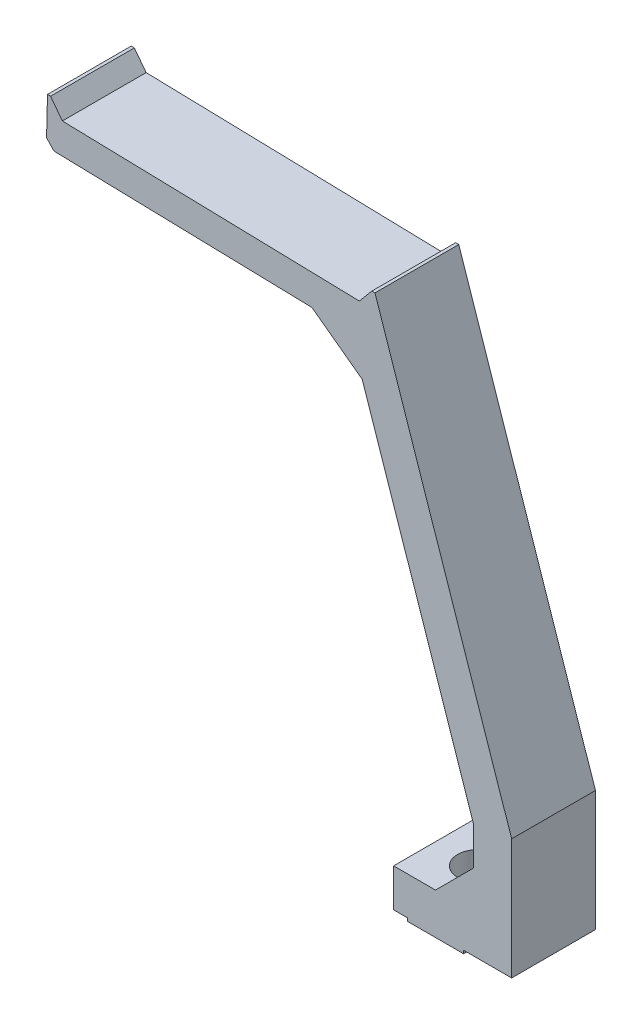
ISO-10303-21;
HEADER;
FILE_DESCRIPTION(('STEP AP214'),'2;1');
FILE_NAME('part.step','',(''),(''),'','','');
FILE_SCHEMA(('AUTOMOTIVE_DESIGN { 1 0 10303 214 1 1 1 1 }'));
ENDSEC;
DATA;
#1=APPLICATION_CONTEXT('core data for automotive mechanical design processes');
#2=APPLICATION_PROTOCOL_DEFINITION('international standard','automotive_design',2000,#1);
#3=PRODUCT_CONTEXT('',#1,'mechanical');
#4=PRODUCT('Part','Part','',(#3));
#5=PRODUCT_RELATED_PRODUCT_CATEGORY('part','',(#4));
#6=PRODUCT_DEFINITION_FORMATION('','',#4);
#7=PRODUCT_DEFINITION_CONTEXT('part definition',#1,'design');
#8=PRODUCT_DEFINITION('design','',#6,#7);
#9=PRODUCT_DEFINITION_SHAPE('','',#8);
#10=(LENGTH_UNIT() NAMED_UNIT(*) SI_UNIT(.MILLI.,.METRE.));
#11=(NAMED_UNIT(*) PLANE_ANGLE_UNIT() SI_UNIT($,.RADIAN.));
#12=(NAMED_UNIT(*) SI_UNIT($,.STERADIAN.) SOLID_ANGLE_UNIT());
#13=UNCERTAINTY_MEASURE_WITH_UNIT(LENGTH_MEASURE(1.E-05),#10,'distance_accuracy_value','');
#14=(GEOMETRIC_REPRESENTATION_CONTEXT(3) GLOBAL_UNCERTAINTY_ASSIGNED_CONTEXT((#13)) GLOBAL_UNIT_ASSIGNED_CONTEXT((#10,
#11,#12)) REPRESENTATION_CONTEXT('',''));
#15=CARTESIAN_POINT('',(0.,0.,0.));
#16=DIRECTION('',(0.,0.,1.));
#17=DIRECTION('',(1.,0.,0.));
#18=AXIS2_PLACEMENT_3D('',#15,#16,#17);
#19=CARTESIAN_POINT('',(0.,5.4,11.));
#20=DIRECTION('',(-0.707106781186547,0.707106781186548,0.));
#21=DIRECTION('',(0.,0.,1.));
#22=AXIS2_PLACEMENT_3D('',#19,#20,#21);
#23=PLANE('',#22);
#24=CARTESIAN_POINT('',(0.,5.40000000000002,5.5));
#25=DIRECTION('',(-0.707106781186547,0.707106781186548,0.));
#26=DIRECTION('',(-0.707106781186548,-0.707106781186547,0.));
#27=AXIS2_PLACEMENT_3D('',#24,#25,#26);
#28=ELLIPSE('',#27,7.07106781186548,5.);
#29=CARTESIAN_POINT('',(0.,5.4,10.5));
#30=VERTEX_POINT('',#29);
#31=CARTESIAN_POINT('',(4.99999999999998,10.4,5.5));
#32=VERTEX_POINT('',#31);
#33=EDGE_CURVE('E11',#30,#32,#28,.T.);
#34=ORIENTED_EDGE('',*,*,#33,.F.);
#35=DIRECTION('',(0.,0.,-1.));
#36=VECTOR('',#35,1.);
#37=CARTESIAN_POINT('',(0.,5.4,0.));
#38=LINE('',#37,#36);
#39=CARTESIAN_POINT('',(0.,5.4,11.));
#40=VERTEX_POINT('',#39);
#41=EDGE_CURVE('E201',#40,#30,#38,.T.);
#42=ORIENTED_EDGE('',*,*,#41,.F.);
#43=DIRECTION('',(0.707106781186548,0.707106781186547,0.));
#44=VECTOR('',#43,1.);
#45=CARTESIAN_POINT('',(-2.70000000000001,2.70000000000001,11.));
#46=LINE('',#45,#44);
#47=CARTESIAN_POINT('',(5.,10.4,11.));
#48=VERTEX_POINT('',#47);
#49=EDGE_CURVE('E225',#48,#40,#46,.F.);
#50=ORIENTED_EDGE('',*,*,#49,.F.);
#51=DIRECTION('',(0.,0.,1.));
#52=VECTOR('',#51,1.);
#53=CARTESIAN_POINT('',(5.,10.4,11.));
#54=LINE('',#53,#52);
#55=EDGE_CURVE('E202',#32,#48,#54,.T.);
#56=ORIENTED_EDGE('',*,*,#55,.F.);
#57=EDGE_LOOP('',(#34,#42,#50,#56));
#58=FACE_BOUND('',#57,.T.);
#59=ADVANCED_FACE('F36',(#58),#23,.T.);
#60=CARTESIAN_POINT('',(0.,5.4,0.499999999999997));
#61=VERTEX_POINT('',#60);
#62=EDGE_CURVE('E40',#32,#61,#28,.T.);
#63=ORIENTED_EDGE('',*,*,#62,.F.);
#64=CARTESIAN_POINT('',(5.,10.4,0.));
#65=VERTEX_POINT('',#64);
#66=EDGE_CURVE('E211',#65,#32,#54,.T.);
#67=ORIENTED_EDGE('',*,*,#66,.F.);
#68=DIRECTION('',(-0.707106781186548,-0.707106781186547,0.));
#69=VECTOR('',#68,1.);
#70=CARTESIAN_POINT('',(0.,5.4,0.));
#71=LINE('',#70,#69);
#72=CARTESIAN_POINT('',(0.,5.4,0.));
#73=VERTEX_POINT('',#72);
#74=EDGE_CURVE('E223',#73,#65,#71,.F.);
#75=ORIENTED_EDGE('',*,*,#74,.F.);
#76=EDGE_CURVE('E209',#61,#73,#38,.T.);
#77=ORIENTED_EDGE('',*,*,#76,.F.);
#78=EDGE_LOOP('',(#63,#67,#75,#77));
#79=FACE_BOUND('',#78,.T.);
#80=ADVANCED_FACE('F263',(#79),#23,.T.);
#81=CARTESIAN_POINT('',(-5.5,0.4,11.));
#82=DIRECTION('',(1.,0.,0.));
#83=DIRECTION('',(0.,1.,0.));
#84=AXIS2_PLACEMENT_3D('',#81,#82,#83);
#85=PLANE('',#84);
#86=DIRECTION('',(0.,-1.,0.));
#87=VECTOR('',#86,1.);
#88=CARTESIAN_POINT('',(-5.5,0.4,0.));
#89=LINE('',#88,#87);
#90=CARTESIAN_POINT('',(-5.5,5.4,0.));
#91=VERTEX_POINT('',#90);
#92=CARTESIAN_POINT('',(-5.5,0.4,0.));
#93=VERTEX_POINT('',#92);
#94=EDGE_CURVE('E564',#91,#93,#89,.T.);
#95=ORIENTED_EDGE('',*,*,#94,.T.);
#96=DIRECTION('',(0.,0.,-1.));
#97=VECTOR('',#96,1.);
#98=CARTESIAN_POINT('',(-5.5,0.4,11.));
#99=LINE('',#98,#97);
#100=CARTESIAN_POINT('',(-5.5,0.4,11.));
#101=VERTEX_POINT('',#100);
#102=EDGE_CURVE('E213',#101,#93,#99,.T.);
#103=ORIENTED_EDGE('',*,*,#102,.F.);
#104=DIRECTION('',(0.,-1.,0.));
#105=VECTOR('',#104,1.);
#106=CARTESIAN_POINT('',(-5.5,0.4,11.));
#107=LINE('',#106,#105);
#108=CARTESIAN_POINT('',(-5.5,5.4,11.));
#109=VERTEX_POINT('',#108);
#110=EDGE_CURVE('E512',#109,#101,#107,.T.);
#111=ORIENTED_EDGE('',*,*,#110,.F.);
#112=DIRECTION('',(0.,0.,-1.));
#113=VECTOR('',#112,1.);
#114=CARTESIAN_POINT('',(-5.5,5.4,11.));
#115=LINE('',#114,#113);
#116=EDGE_CURVE('E513',#109,#91,#115,.T.);
#117=ORIENTED_EDGE('',*,*,#116,.T.);
#118=EDGE_LOOP('',(#95,#103,#111,#117));
#119=FACE_BOUND('',#118,.T.);
#120=ADVANCED_FACE('F268',(#119),#85,.F.);
#121=CARTESIAN_POINT('',(-5.5,0.4,11.));
#122=DIRECTION('',(0.,1.,0.));
#123=DIRECTION('',(-1.,0.,0.));
#124=AXIS2_PLACEMENT_3D('',#121,#122,#123);
#125=PLANE('',#124);
#126=DIRECTION('',(1.,0.,0.));
#127=VECTOR('',#126,1.);
#128=CARTESIAN_POINT('',(-5.5,0.4,0.));
#129=LINE('',#128,#127);
#130=CARTESIAN_POINT('',(-3.7,0.4,0.));
#131=VERTEX_POINT('',#130);
#132=EDGE_CURVE('E559',#93,#131,#129,.T.);
#133=ORIENTED_EDGE('',*,*,#132,.T.);
#134=DIRECTION('',(0.,0.,-1.));
#135=VECTOR('',#134,1.);
#136=CARTESIAN_POINT('',(-3.7,0.4,11.));
#137=LINE('',#136,#135);
#138=CARTESIAN_POINT('',(-3.7,0.4,11.));
#139=VERTEX_POINT('',#138);
#140=EDGE_CURVE('E551',#139,#131,#137,.T.);
#141=ORIENTED_EDGE('',*,*,#140,.F.);
#142=DIRECTION('',(1.,0.,0.));
#143=VECTOR('',#142,1.);
#144=CARTESIAN_POINT('',(-5.5,0.4,11.));
#145=LINE('',#144,#143);
#146=EDGE_CURVE('E560',#101,#139,#145,.T.);
#147=ORIENTED_EDGE('',*,*,#146,.F.);
#148=ORIENTED_EDGE('',*,*,#102,.T.);
#149=EDGE_LOOP('',(#133,#141,#147,#148));
#150=FACE_BOUND('',#149,.T.);
#151=ADVANCED_FACE('F273',(#150),#125,.F.);
#152=CARTESIAN_POINT('',(-3.7,0.4,11.));
#153=DIRECTION('',(1.,0.,0.));
#154=DIRECTION('',(0.,0.,-1.));
#155=AXIS2_PLACEMENT_3D('',#152,#153,#154);
#156=PLANE('',#155);
#157=DIRECTION('',(0.,-1.,0.));
#158=VECTOR('',#157,1.);
#159=CARTESIAN_POINT('',(-3.7,0.4,0.));
#160=LINE('',#159,#158);
#161=CARTESIAN_POINT('',(-3.7,0.,0.));
#162=VERTEX_POINT('',#161);
#163=EDGE_CURVE('E568',#131,#162,#160,.T.);
#164=ORIENTED_EDGE('',*,*,#163,.T.);
#165=DIRECTION('',(0.,0.,-1.));
#166=VECTOR('',#165,1.);
#167=CARTESIAN_POINT('',(-3.7,0.,11.));
#168=LINE('',#167,#166);
#169=CARTESIAN_POINT('',(-3.7,0.,11.));
#170=VERTEX_POINT('',#169);
#171=EDGE_CURVE('E549',#170,#162,#168,.T.);
#172=ORIENTED_EDGE('',*,*,#171,.F.);
#173=DIRECTION('',(0.,-1.,0.));
#174=VECTOR('',#173,1.);
#175=CARTESIAN_POINT('',(-3.7,0.4,11.));
#176=LINE('',#175,#174);
#177=EDGE_CURVE('E608',#139,#170,#176,.T.);
#178=ORIENTED_EDGE('',*,*,#177,.F.);
#179=ORIENTED_EDGE('',*,*,#140,.T.);
#180=EDGE_LOOP('',(#164,#172,#178,#179));
#181=FACE_BOUND('',#180,.T.);
#182=ADVANCED_FACE('F277',(#181),#156,.F.);
#183=CARTESIAN_POINT('',(-3.7,0.,11.));
#184=DIRECTION('',(0.,1.,0.));
#185=DIRECTION('',(0.,0.,1.));
#186=AXIS2_PLACEMENT_3D('',#183,#184,#185);
#187=PLANE('',#186);
#188=CARTESIAN_POINT('',(0.,0.,5.5));
#189=DIRECTION('',(0.,1.,0.));
#190=DIRECTION('',(0.,0.,1.));
#191=AXIS2_PLACEMENT_3D('',#188,#189,#190);
#192=CIRCLE('',#191,2.6);
#193=CARTESIAN_POINT('',(0.,0.,8.1));
#194=VERTEX_POINT('',#193);
#195=EDGE_CURVE('E566',#194,#194,#192,.T.);
#196=ORIENTED_EDGE('',*,*,#195,.T.);
#197=EDGE_LOOP('',(#196));
#198=FACE_BOUND('',#197,.T.);
#199=DIRECTION('',(1.,0.,0.));
#200=VECTOR('',#199,1.);
#201=CARTESIAN_POINT('',(-3.7,0.,0.));
#202=LINE('',#201,#200);
#203=CARTESIAN_POINT('',(3.7,0.,0.));
#204=VERTEX_POINT('',#203);
#205=EDGE_CURVE('E576',#162,#204,#202,.T.);
#206=ORIENTED_EDGE('',*,*,#205,.T.);
#207=DIRECTION('',(0.,0.,-1.));
#208=VECTOR('',#207,1.);
#209=CARTESIAN_POINT('',(3.7,0.,11.));
#210=LINE('',#209,#208);
#211=CARTESIAN_POINT('',(3.7,0.,11.));
#212=VERTEX_POINT('',#211);
#213=EDGE_CURVE('E546',#212,#204,#210,.T.);
#214=ORIENTED_EDGE('',*,*,#213,.F.);
#215=DIRECTION('',(1.,0.,0.));
#216=VECTOR('',#215,1.);
#217=CARTESIAN_POINT('',(-3.7,0.,11.));
#218=LINE('',#217,#216);
#219=EDGE_CURVE('E613',#170,#212,#218,.T.);
#220=ORIENTED_EDGE('',*,*,#219,.F.);
#221=ORIENTED_EDGE('',*,*,#171,.T.);
#222=EDGE_LOOP('',(#206,#214,#220,#221));
#223=FACE_BOUND('',#222,.T.);
#224=ADVANCED_FACE('F281',(#198,#223),#187,.F.);
#225=CARTESIAN_POINT('',(3.7,0.,11.));
#226=DIRECTION('',(-1.,0.,0.));
#227=DIRECTION('',(0.,0.,1.));
#228=AXIS2_PLACEMENT_3D('',#225,#226,#227);
#229=PLANE('',#228);
#230=DIRECTION('',(0.,1.,0.));
#231=VECTOR('',#230,1.);
#232=CARTESIAN_POINT('',(3.7,0.,0.));
#233=LINE('',#232,#231);
#234=CARTESIAN_POINT('',(3.7,0.4,0.));
#235=VERTEX_POINT('',#234);
#236=EDGE_CURVE('E578',#204,#235,#233,.T.);
#237=ORIENTED_EDGE('',*,*,#236,.T.);
#238=DIRECTION('',(0.,0.,-1.));
#239=VECTOR('',#238,1.);
#240=CARTESIAN_POINT('',(3.7,0.4,11.));
#241=LINE('',#240,#239);
#242=CARTESIAN_POINT('',(3.7,0.4,11.));
#243=VERTEX_POINT('',#242);
#244=EDGE_CURVE('E543',#243,#235,#241,.T.);
#245=ORIENTED_EDGE('',*,*,#244,.F.);
#246=DIRECTION('',(0.,1.,0.));
#247=VECTOR('',#246,1.);
#248=CARTESIAN_POINT('',(3.7,0.,11.));
#249=LINE('',#248,#247);
#250=EDGE_CURVE('E615',#212,#243,#249,.T.);
#251=ORIENTED_EDGE('',*,*,#250,.F.);
#252=ORIENTED_EDGE('',*,*,#213,.T.);
#253=EDGE_LOOP('',(#237,#245,#251,#252));
#254=FACE_BOUND('',#253,.T.);
#255=ADVANCED_FACE('F285',(#254),#229,.F.);
#256=CARTESIAN_POINT('',(3.7,0.4,11.));
#257=DIRECTION('',(0.,1.,0.));
#258=DIRECTION('',(-1.,0.,0.));
#259=AXIS2_PLACEMENT_3D('',#256,#257,#258);
#260=PLANE('',#259);
#261=DIRECTION('',(1.,0.,0.));
#262=VECTOR('',#261,1.);
#263=CARTESIAN_POINT('',(3.7,0.4,0.));
#264=LINE('',#263,#262);
#265=CARTESIAN_POINT('',(10.,0.4,0.));
#266=VERTEX_POINT('',#265);
#267=EDGE_CURVE('E580',#235,#266,#264,.T.);
#268=ORIENTED_EDGE('',*,*,#267,.T.);
#269=DIRECTION('',(0.,0.,-1.));
#270=VECTOR('',#269,1.);
#271=CARTESIAN_POINT('',(10.,0.4,11.));
#272=LINE('',#271,#270);
#273=CARTESIAN_POINT('',(10.,0.4,11.));
#274=VERTEX_POINT('',#273);
#275=EDGE_CURVE('E540',#274,#266,#272,.T.);
#276=ORIENTED_EDGE('',*,*,#275,.F.);
#277=DIRECTION('',(1.,0.,0.));
#278=VECTOR('',#277,1.);
#279=CARTESIAN_POINT('',(3.7,0.4,11.));
#280=LINE('',#279,#278);
#281=EDGE_CURVE('E617',#243,#274,#280,.T.);
#282=ORIENTED_EDGE('',*,*,#281,.F.);
#283=ORIENTED_EDGE('',*,*,#244,.T.);
#284=EDGE_LOOP('',(#268,#276,#282,#283));
#285=FACE_BOUND('',#284,.T.);
#286=ADVANCED_FACE('F289',(#285),#260,.F.);
#287=CARTESIAN_POINT('',(10.,0.4,11.));
#288=DIRECTION('',(-1.,0.,0.));
#289=DIRECTION('',(0.,0.,1.));
#290=AXIS2_PLACEMENT_3D('',#287,#288,#289);
#291=PLANE('',#290);
#292=DIRECTION('',(0.,1.,0.));
#293=VECTOR('',#292,1.);
#294=CARTESIAN_POINT('',(10.,0.4,0.));
#295=LINE('',#294,#293);
#296=CARTESIAN_POINT('',(10.,16.2223077255766,0.));
#297=VERTEX_POINT('',#296);
#298=EDGE_CURVE('E582',#266,#297,#295,.T.);
#299=ORIENTED_EDGE('',*,*,#298,.T.);
#300=DIRECTION('',(0.,0.,-1.));
#301=VECTOR('',#300,1.);
#302=CARTESIAN_POINT('',(10.,16.2223077255766,11.));
#303=LINE('',#302,#301);
#304=CARTESIAN_POINT('',(10.,16.2223077255766,11.));
#305=VERTEX_POINT('',#304);
#306=EDGE_CURVE('E537',#305,#297,#303,.T.);
#307=ORIENTED_EDGE('',*,*,#306,.F.);
#308=DIRECTION('',(0.,1.,0.));
#309=VECTOR('',#308,1.);
#310=CARTESIAN_POINT('',(10.,0.4,11.));
#311=LINE('',#310,#309);
#312=EDGE_CURVE('E619',#274,#305,#311,.T.);
#313=ORIENTED_EDGE('',*,*,#312,.F.);
#314=ORIENTED_EDGE('',*,*,#275,.T.);
#315=EDGE_LOOP('',(#299,#307,#313,#314));
#316=FACE_BOUND('',#315,.T.);
#317=ADVANCED_FACE('F293',(#316),#291,.F.);
#318=CARTESIAN_POINT('',(10.,16.2223077255766,11.));
#319=DIRECTION('',(-0.94732941330782,-0.320260804161019,0.));
#320=DIRECTION('',(0.320260804161019,-0.94732941330782,0.));
#321=AXIS2_PLACEMENT_3D('',#318,#319,#320);
#322=PLANE('',#321);
#323=DIRECTION('',(-0.320260804161019,0.94732941330782,0.));
#324=VECTOR('',#323,1.);
#325=CARTESIAN_POINT('',(10.,16.2223077255766,0.));
#326=LINE('',#325,#324);
#327=CARTESIAN_POINT('',(-7.95046952320637,69.3196819314732,0.));
#328=VERTEX_POINT('',#327);
#329=EDGE_CURVE('E584',#297,#328,#326,.T.);
#330=ORIENTED_EDGE('',*,*,#329,.T.);
#331=DIRECTION('',(0.,0.,-1.));
#332=VECTOR('',#331,1.);
#333=CARTESIAN_POINT('',(-7.95046952320637,69.3196819314732,11.));
#334=LINE('',#333,#332);
#335=CARTESIAN_POINT('',(-7.95046952320637,69.3196819314732,11.));
#336=VERTEX_POINT('',#335);
#337=EDGE_CURVE('E534',#336,#328,#334,.T.);
#338=ORIENTED_EDGE('',*,*,#337,.F.);
#339=DIRECTION('',(-0.320260804161019,0.94732941330782,0.));
#340=VECTOR('',#339,1.);
#341=CARTESIAN_POINT('',(10.,16.2223077255766,11.));
#342=LINE('',#341,#340);
#343=EDGE_CURVE('E621',#305,#336,#342,.T.);
#344=ORIENTED_EDGE('',*,*,#343,.F.);
#345=ORIENTED_EDGE('',*,*,#306,.T.);
#346=EDGE_LOOP('',(#330,#338,#344,#345));
#347=FACE_BOUND('',#346,.T.);
#348=ADVANCED_FACE('F297',(#347),#322,.F.);
#349=CARTESIAN_POINT('',(-7.95046952320637,69.3196819314732,11.));
#350=DIRECTION('',(-0.0250797856919671,-0.999685452704822,0.));
#351=DIRECTION('',(0.999685452704822,-0.0250797856919671,0.));
#352=AXIS2_PLACEMENT_3D('',#349,#350,#351);
#353=PLANE('',#352);
#354=DIRECTION('',(-0.999685452704822,0.0250797856919671,0.));
#355=VECTOR('',#354,1.);
#356=CARTESIAN_POINT('',(-7.95046952320637,69.3196819314732,0.));
#357=LINE('',#356,#355);
#358=CARTESIAN_POINT('',(-8.3503437042883,69.32971384575,0.));
#359=VERTEX_POINT('',#358);
#360=EDGE_CURVE('E586',#328,#359,#357,.T.);
#361=ORIENTED_EDGE('',*,*,#360,.T.);
#362=DIRECTION('',(0.,0.,-1.));
#363=VECTOR('',#362,1.);
#364=CARTESIAN_POINT('',(-8.3503437042883,69.32971384575,11.));
#365=LINE('',#364,#363);
#366=CARTESIAN_POINT('',(-8.3503437042883,69.32971384575,11.));
#367=VERTEX_POINT('',#366);
#368=EDGE_CURVE('E531',#367,#359,#365,.T.);
#369=ORIENTED_EDGE('',*,*,#368,.F.);
#370=DIRECTION('',(-0.999685452704822,0.0250797856919671,0.));
#371=VECTOR('',#370,1.);
#372=CARTESIAN_POINT('',(-7.95046952320637,69.3196819314732,11.));
#373=LINE('',#372,#371);
#374=EDGE_CURVE('E623',#336,#367,#373,.T.);
#375=ORIENTED_EDGE('',*,*,#374,.F.);
#376=ORIENTED_EDGE('',*,*,#337,.T.);
#377=EDGE_LOOP('',(#361,#369,#375,#376));
#378=FACE_BOUND('',#377,.T.);
#379=ADVANCED_FACE('F301',(#378),#353,.F.);
#380=CARTESIAN_POINT('',(-8.3503437042883,69.32971384575,11.));
#381=DIRECTION('',(0.764955971355616,-0.644082573811299,0.));
#382=DIRECTION('',(0.644082573811299,0.764955971355616,0.));
#383=AXIS2_PLACEMENT_3D('',#380,#381,#382);
#384=PLANE('',#383);
#385=DIRECTION('',(-0.644082573811298,-0.764955971355615,0.));
#386=VECTOR('',#385,1.);
#387=CARTESIAN_POINT('',(-8.3503437042883,69.32971384575,0.));
#388=LINE('',#387,#386);
#389=CARTESIAN_POINT('',(-10.,67.3704705974476,0.));
#390=VERTEX_POINT('',#389);
#391=EDGE_CURVE('E588',#359,#390,#388,.T.);
#392=ORIENTED_EDGE('',*,*,#391,.T.);
#393=DIRECTION('',(0.,0.,-1.));
#394=VECTOR('',#393,1.);
#395=CARTESIAN_POINT('',(-10.,67.3704705974476,11.));
#396=LINE('',#395,#394);
#397=CARTESIAN_POINT('',(-10.,67.3704705974476,11.));
#398=VERTEX_POINT('',#397);
#399=EDGE_CURVE('E528',#398,#390,#396,.T.);
#400=ORIENTED_EDGE('',*,*,#399,.F.);
#401=DIRECTION('',(-0.644082573811298,-0.764955971355615,0.));
#402=VECTOR('',#401,1.);
#403=CARTESIAN_POINT('',(-8.3503437042883,69.32971384575,11.));
#404=LINE('',#403,#402);
#405=EDGE_CURVE('E625',#367,#398,#404,.T.);
#406=ORIENTED_EDGE('',*,*,#405,.F.);
#407=ORIENTED_EDGE('',*,*,#368,.T.);
#408=EDGE_LOOP('',(#392,#400,#406,#407));
#409=FACE_BOUND('',#408,.T.);
#410=ADVANCED_FACE('F305',(#409),#384,.F.);
#411=CARTESIAN_POINT('',(-10.,67.3704705974476,11.));
#412=DIRECTION('',(-0.0250797856919927,-0.999685452704822,0.));
#413=DIRECTION('',(0.999685452704822,-0.0250797856919927,0.));
#414=AXIS2_PLACEMENT_3D('',#411,#412,#413);
#415=PLANE('',#414);
#416=DIRECTION('',(-0.999685452704821,0.0250797856919927,0.));
#417=VECTOR('',#416,1.);
#418=CARTESIAN_POINT('',(-10.,67.3704705974476,0.));
#419=LINE('',#418,#417);
#420=CARTESIAN_POINT('',(-48.987732655488,68.3485822394353,0.));
#421=VERTEX_POINT('',#420);
#422=EDGE_CURVE('E590',#390,#421,#419,.T.);
#423=ORIENTED_EDGE('',*,*,#422,.T.);
#424=DIRECTION('',(0.,0.,-1.));
#425=VECTOR('',#424,1.);
#426=CARTESIAN_POINT('',(-48.987732655488,68.3485822394353,11.));
#427=LINE('',#426,#425);
#428=CARTESIAN_POINT('',(-48.987732655488,68.3485822394353,11.));
#429=VERTEX_POINT('',#428);
#430=EDGE_CURVE('E525',#429,#421,#427,.T.);
#431=ORIENTED_EDGE('',*,*,#430,.F.);
#432=DIRECTION('',(-0.999685452704821,0.0250797856919927,0.));
#433=VECTOR('',#432,1.);
#434=CARTESIAN_POINT('',(-10.,67.3704705974476,11.));
#435=LINE('',#434,#433);
#436=EDGE_CURVE('E627',#398,#429,#435,.T.);
#437=ORIENTED_EDGE('',*,*,#436,.F.);
#438=ORIENTED_EDGE('',*,*,#399,.T.);
#439=EDGE_LOOP('',(#423,#431,#437,#438));
#440=FACE_BOUND('',#439,.T.);
#441=ADVANCED_FACE('F309',(#440),#415,.F.);
#442=CARTESIAN_POINT('',(-50.5370698084318,70.3880808019522,11.));
#443=DIRECTION('',(-0.796290407186653,-0.604914529022502,0.));
#444=DIRECTION('',(0.604914529022502,-0.796290407186653,0.));
#445=AXIS2_PLACEMENT_3D('',#442,#443,#444);
#446=PLANE('',#445);
#447=DIRECTION('',(-0.604914529022502,0.796290407186653,0.));
#448=VECTOR('',#447,1.);
#449=CARTESIAN_POINT('',(-50.5370698084318,70.3880808019522,0.));
#450=LINE('',#449,#448);
#451=CARTESIAN_POINT('',(-50.5370698084318,70.3880808019522,0.));
#452=VERTEX_POINT('',#451);
#453=EDGE_CURVE('E592',#421,#452,#450,.T.);
#454=ORIENTED_EDGE('',*,*,#453,.T.);
#455=DIRECTION('',(0.,0.,-1.));
#456=VECTOR('',#455,1.);
#457=CARTESIAN_POINT('',(-50.5370698084318,70.3880808019522,11.));
#458=LINE('',#457,#456);
#459=CARTESIAN_POINT('',(-50.5370698084318,70.3880808019522,11.));
#460=VERTEX_POINT('',#459);
#461=EDGE_CURVE('E522',#460,#452,#458,.T.);
#462=ORIENTED_EDGE('',*,*,#461,.F.);
#463=DIRECTION('',(-0.604914529022502,0.796290407186653,0.));
#464=VECTOR('',#463,1.);
#465=CARTESIAN_POINT('',(-50.5370698084318,70.3880808019522,11.));
#466=LINE('',#465,#464);
#467=EDGE_CURVE('E600',#429,#460,#466,.T.);
#468=ORIENTED_EDGE('',*,*,#467,.F.);
#469=ORIENTED_EDGE('',*,*,#430,.T.);
#470=EDGE_LOOP('',(#454,#462,#468,#469));
#471=FACE_BOUND('',#470,.T.);
#472=ADVANCED_FACE('F313',(#471),#446,.F.);
#473=CARTESIAN_POINT('',(-50.9369439895137,70.3981127162289,11.));
#474=DIRECTION('',(-0.0250797856918631,-0.999685452704825,0.));
#475=DIRECTION('',(0.999685452704825,-0.0250797856918631,0.));
#476=AXIS2_PLACEMENT_3D('',#473,#474,#475);
#477=PLANE('',#476);
#478=DIRECTION('',(-0.999685452704825,0.0250797856918631,0.));
#479=VECTOR('',#478,1.);
#480=CARTESIAN_POINT('',(-50.9369439895137,70.3981127162289,0.));
#481=LINE('',#480,#479);
#482=CARTESIAN_POINT('',(-50.9369439895137,70.3981127162289,0.));
#483=VERTEX_POINT('',#482);
#484=EDGE_CURVE('E504',#452,#483,#481,.T.);
#485=ORIENTED_EDGE('',*,*,#484,.T.);
#486=DIRECTION('',(0.,0.,-1.));
#487=VECTOR('',#486,1.);
#488=CARTESIAN_POINT('',(-50.9369439895137,70.3981127162289,11.));
#489=LINE('',#488,#487);
#490=CARTESIAN_POINT('',(-50.9369439895137,70.3981127162289,11.));
#491=VERTEX_POINT('',#490);
#492=EDGE_CURVE('E519',#491,#483,#489,.T.);
#493=ORIENTED_EDGE('',*,*,#492,.F.);
#494=DIRECTION('',(-0.999685452704825,0.0250797856918631,0.));
#495=VECTOR('',#494,1.);
#496=CARTESIAN_POINT('',(-50.9369439895137,70.3981127162289,11.));
#497=LINE('',#496,#495);
#498=EDGE_CURVE('E598',#460,#491,#497,.T.);
#499=ORIENTED_EDGE('',*,*,#498,.F.);
#500=ORIENTED_EDGE('',*,*,#461,.T.);
#501=EDGE_LOOP('',(#485,#493,#499,#500));
#502=FACE_BOUND('',#501,.T.);
#503=ADVANCED_FACE('F317',(#502),#477,.F.);
#504=CARTESIAN_POINT('',(-51.0874227036656,64.4,11.));
#505=DIRECTION('',(0.999685452704822,-0.0250797856919937,0.));
#506=DIRECTION('',(0.0250797856919937,0.999685452704822,0.));
#507=AXIS2_PLACEMENT_3D('',#504,#505,#506);
#508=PLANE('',#507);
#509=DIRECTION('',(-0.0250797856919937,-0.999685452704821,0.));
#510=VECTOR('',#509,1.);
#511=CARTESIAN_POINT('',(-51.0874227036656,64.4,0.));
#512=LINE('',#511,#510);
#513=CARTESIAN_POINT('',(-51.0623429179737,65.3996854527048,0.));
#514=VERTEX_POINT('',#513);
#515=EDGE_CURVE('E500',#483,#514,#512,.T.);
#516=ORIENTED_EDGE('',*,*,#515,.T.);
#517=DIRECTION('',(0.,0.,1.));
#518=VECTOR('',#517,1.);
#519=CARTESIAN_POINT('',(-51.0623429179737,65.3996854527048,11.));
#520=LINE('',#519,#518);
#521=CARTESIAN_POINT('',(-51.0623429179737,65.3996854527048,11.));
#522=VERTEX_POINT('',#521);
#523=EDGE_CURVE('E51',#514,#522,#520,.T.);
#524=ORIENTED_EDGE('',*,*,#523,.T.);
#525=DIRECTION('',(-0.0250797856919937,-0.999685452704821,0.));
#526=VECTOR('',#525,1.);
#527=CARTESIAN_POINT('',(-51.0874227036656,64.4,11.));
#528=LINE('',#527,#526);
#529=EDGE_CURVE('E242',#491,#522,#528,.T.);
#530=ORIENTED_EDGE('',*,*,#529,.F.);
#531=ORIENTED_EDGE('',*,*,#492,.T.);
#532=EDGE_LOOP('',(#516,#524,#530,#531));
#533=FACE_BOUND('',#532,.T.);
#534=ADVANCED_FACE('F321',(#533),#508,.F.);
#535=CARTESIAN_POINT('',(-11.2272155638577,63.4,11.));
#536=DIRECTION('',(0.0250797856919927,0.999685452704822,0.));
#537=DIRECTION('',(-0.999685452704822,0.0250797856919927,0.));
#538=AXIS2_PLACEMENT_3D('',#535,#536,#537);
#539=PLANE('',#538);
#540=DIRECTION('',(0.999685452704821,-0.0250797856919927,0.));
#541=VECTOR('',#540,1.);
#542=CARTESIAN_POINT('',(-11.2272155638577,63.4,11.));
#543=LINE('',#542,#541);
#544=CARTESIAN_POINT('',(-50.0877372509608,64.374920214308,11.));
#545=VERTEX_POINT('',#544);
#546=CARTESIAN_POINT('',(-16.2256428273818,63.5253989284599,11.));
#547=VERTEX_POINT('',#546);
#548=EDGE_CURVE('E241',#545,#547,#543,.T.);
#549=ORIENTED_EDGE('',*,*,#548,.F.);
#550=DIRECTION('',(0.,0.,-1.));
#551=VECTOR('',#550,1.);
#552=CARTESIAN_POINT('',(-50.0877372509608,64.374920214308,11.));
#553=LINE('',#552,#551);
#554=CARTESIAN_POINT('',(-50.0877372509608,64.374920214308,0.));
#555=VERTEX_POINT('',#554);
#556=EDGE_CURVE('E232',#545,#555,#553,.T.);
#557=ORIENTED_EDGE('',*,*,#556,.T.);
#558=DIRECTION('',(0.999685452704821,-0.0250797856919927,0.));
#559=VECTOR('',#558,1.);
#560=CARTESIAN_POINT('',(-11.2272155638577,63.4,0.));
#561=LINE('',#560,#559);
#562=CARTESIAN_POINT('',(-16.2256428273818,63.5253989284599,0.));
#563=VERTEX_POINT('',#562);
#564=EDGE_CURVE('E497',#555,#563,#561,.T.);
#565=ORIENTED_EDGE('',*,*,#564,.T.);
#566=DIRECTION('',(0.,0.,1.));
#567=VECTOR('',#566,1.);
#568=CARTESIAN_POINT('',(-16.2256428273818,63.5253989284599,11.));
#569=LINE('',#568,#567);
#570=EDGE_CURVE('E220',#563,#547,#569,.T.);
#571=ORIENTED_EDGE('',*,*,#570,.T.);
#572=EDGE_LOOP('',(#549,#557,#565,#571));
#573=FACE_BOUND('',#572,.T.);
#574=ADVANCED_FACE('F246',(#573),#539,.F.);
#575=CARTESIAN_POINT('',(5.,15.4,11.));
#576=DIRECTION('',(0.94732941330782,0.320260804161017,0.));
#577=DIRECTION('',(-0.320260804161017,0.94732941330782,0.));
#578=AXIS2_PLACEMENT_3D('',#575,#576,#577);
#579=PLANE('',#578);
#580=DIRECTION('',(0.320260804161017,-0.94732941330782,0.));
#581=VECTOR('',#580,1.);
#582=CARTESIAN_POINT('',(5.,15.4,11.));
#583=LINE('',#582,#581);
#584=CARTESIAN_POINT('',(-9.6259115430526,58.6633529334609,11.));
#585=VERTEX_POINT('',#584);
#586=CARTESIAN_POINT('',(5.,15.4,11.));
#587=VERTEX_POINT('',#586);
#588=EDGE_CURVE('E249',#585,#587,#583,.T.);
#589=ORIENTED_EDGE('',*,*,#588,.F.);
#590=DIRECTION('',(0.,0.,-1.));
#591=VECTOR('',#590,1.);
#592=CARTESIAN_POINT('',(-9.62591154305259,58.6633529334609,0.));
#593=LINE('',#592,#591);
#594=CARTESIAN_POINT('',(-9.6259115430526,58.6633529334609,0.));
#595=VERTEX_POINT('',#594);
#596=EDGE_CURVE('E217',#585,#595,#593,.T.);
#597=ORIENTED_EDGE('',*,*,#596,.T.);
#598=DIRECTION('',(0.320260804161017,-0.94732941330782,0.));
#599=VECTOR('',#598,1.);
#600=CARTESIAN_POINT('',(5.,15.4,0.));
#601=LINE('',#600,#599);
#602=CARTESIAN_POINT('',(5.,15.4,0.));
#603=VERTEX_POINT('',#602);
#604=EDGE_CURVE('E499',#595,#603,#601,.T.);
#605=ORIENTED_EDGE('',*,*,#604,.T.);
#606=DIRECTION('',(0.,0.,-1.));
#607=VECTOR('',#606,1.);
#608=CARTESIAN_POINT('',(5.,15.4,11.));
#609=LINE('',#608,#607);
#610=EDGE_CURVE('E516',#587,#603,#609,.T.);
#611=ORIENTED_EDGE('',*,*,#610,.F.);
#612=EDGE_LOOP('',(#589,#597,#605,#611));
#613=FACE_BOUND('',#612,.T.);
#614=ADVANCED_FACE('F327',(#613),#579,.F.);
#615=CARTESIAN_POINT('',(5.,5.4,11.));
#616=DIRECTION('',(1.,0.,0.));
#617=DIRECTION('',(0.,1.,0.));
#618=AXIS2_PLACEMENT_3D('',#615,#616,#617);
#619=PLANE('',#618);
#620=DIRECTION('',(0.,-1.,0.));
#621=VECTOR('',#620,1.);
#622=CARTESIAN_POINT('',(5.,5.4,0.));
#623=LINE('',#622,#621);
#624=EDGE_CURVE('E502',#603,#65,#623,.T.);
#625=ORIENTED_EDGE('',*,*,#624,.T.);
#626=ORIENTED_EDGE('',*,*,#66,.T.);
#627=ORIENTED_EDGE('',*,*,#55,.T.);
#628=DIRECTION('',(0.,-1.,0.));
#629=VECTOR('',#628,1.);
#630=CARTESIAN_POINT('',(5.,5.4,11.));
#631=LINE('',#630,#629);
#632=EDGE_CURVE('E604',#587,#48,#631,.T.);
#633=ORIENTED_EDGE('',*,*,#632,.F.);
#634=ORIENTED_EDGE('',*,*,#610,.T.);
#635=EDGE_LOOP('',(#625,#626,#627,#633,#634));
#636=FACE_BOUND('',#635,.T.);
#637=ADVANCED_FACE('F330',(#636),#619,.F.);
#638=CARTESIAN_POINT('',(-5.5,5.4,11.));
#639=DIRECTION('',(0.,-1.,0.));
#640=DIRECTION('',(1.,0.,0.));
#641=AXIS2_PLACEMENT_3D('',#638,#639,#640);
#642=PLANE('',#641);
#643=ORIENTED_EDGE('',*,*,#41,.T.);
#644=CARTESIAN_POINT('',(0.,5.4,5.5));
#645=DIRECTION('',(0.,1.,0.));
#646=DIRECTION('',(0.,0.,1.));
#647=AXIS2_PLACEMENT_3D('',#644,#645,#646);
#648=CIRCLE('',#647,5.);
#649=EDGE_CURVE('E188',#30,#61,#648,.T.);
#650=ORIENTED_EDGE('',*,*,#649,.T.);
#651=ORIENTED_EDGE('',*,*,#76,.T.);
#652=DIRECTION('',(-1.,0.,0.));
#653=VECTOR('',#652,1.);
#654=CARTESIAN_POINT('',(-5.5,5.4,0.));
#655=LINE('',#654,#653);
#656=EDGE_CURVE('E510',#73,#91,#655,.T.);
#657=ORIENTED_EDGE('',*,*,#656,.T.);
#658=ORIENTED_EDGE('',*,*,#116,.F.);
#659=DIRECTION('',(-1.,0.,0.));
#660=VECTOR('',#659,1.);
#661=CARTESIAN_POINT('',(-5.5,5.4,11.));
#662=LINE('',#661,#660);
#663=EDGE_CURVE('E208',#40,#109,#662,.T.);
#664=ORIENTED_EDGE('',*,*,#663,.F.);
#665=EDGE_LOOP('',(#643,#650,#651,#657,#658,#664));
#666=FACE_BOUND('',#665,.T.);
#667=CARTESIAN_POINT('',(0.,5.4,5.5));
#668=DIRECTION('',(0.,1.,0.));
#669=DIRECTION('',(0.,0.,1.));
#670=AXIS2_PLACEMENT_3D('',#667,#668,#669);
#671=CIRCLE('',#670,2.6);
#672=CARTESIAN_POINT('',(0.,5.4,8.1));
#673=VERTEX_POINT('',#672);
#674=EDGE_CURVE('E195',#673,#673,#671,.T.);
#675=ORIENTED_EDGE('',*,*,#674,.F.);
#676=EDGE_LOOP('',(#675));
#677=FACE_BOUND('',#676,.T.);
#678=ADVANCED_FACE('F205',(#666,#677),#642,.F.);
#679=CARTESIAN_POINT('',(0.,0.,11.));
#680=DIRECTION('',(0.,0.,-1.));
#681=DIRECTION('',(-1.,0.,0.));
#682=AXIS2_PLACEMENT_3D('',#679,#680,#681);
#683=PLANE('',#682);
#684=ORIENTED_EDGE('',*,*,#529,.T.);
#685=DIRECTION('',(-0.689150276127608,0.724618449194638,0.));
#686=VECTOR('',#685,1.);
#687=CARTESIAN_POINT('',(-50.0877372509608,64.374920214308,11.));
#688=LINE('',#687,#686);
#689=EDGE_CURVE('E236',#522,#545,#688,.F.);
#690=ORIENTED_EDGE('',*,*,#689,.T.);
#691=ORIENTED_EDGE('',*,*,#548,.T.);
#692=DIRECTION('',(-0.805109075941215,0.593126778890553,0.));
#693=VECTOR('',#692,1.);
#694=CARTESIAN_POINT('',(24.6272240827538,33.4289435748472,11.));
#695=LINE('',#694,#693);
#696=EDGE_CURVE('E230',#547,#585,#695,.F.);
#697=ORIENTED_EDGE('',*,*,#696,.T.);
#698=ORIENTED_EDGE('',*,*,#588,.T.);
#699=ORIENTED_EDGE('',*,*,#632,.T.);
#700=ORIENTED_EDGE('',*,*,#49,.T.);
#701=ORIENTED_EDGE('',*,*,#663,.T.);
#702=ORIENTED_EDGE('',*,*,#110,.T.);
#703=ORIENTED_EDGE('',*,*,#146,.T.);
#704=ORIENTED_EDGE('',*,*,#177,.T.);
#705=ORIENTED_EDGE('',*,*,#219,.T.);
#706=ORIENTED_EDGE('',*,*,#250,.T.);
#707=ORIENTED_EDGE('',*,*,#281,.T.);
#708=ORIENTED_EDGE('',*,*,#312,.T.);
#709=ORIENTED_EDGE('',*,*,#343,.T.);
#710=ORIENTED_EDGE('',*,*,#374,.T.);
#711=ORIENTED_EDGE('',*,*,#405,.T.);
#712=ORIENTED_EDGE('',*,*,#436,.T.);
#713=ORIENTED_EDGE('',*,*,#467,.T.);
#714=ORIENTED_EDGE('',*,*,#498,.T.);
#715=EDGE_LOOP('',(#684,#690,#691,#697,#698,#699,#700,#701,#702,#703,#704,#705,#706,#707,#708,
#709,#710,#711,#712,#713,#714));
#716=FACE_BOUND('',#715,.T.);
#717=ADVANCED_FACE('F240',(#716),#683,.F.);
#718=CARTESIAN_POINT('',(0.,0.,0.));
#719=DIRECTION('',(0.,0.,-1.));
#720=DIRECTION('',(-1.,0.,0.));
#721=AXIS2_PLACEMENT_3D('',#718,#719,#720);
#722=PLANE('',#721);
#723=ORIENTED_EDGE('',*,*,#564,.F.);
#724=DIRECTION('',(0.689150276127608,-0.724618449194638,0.));
#725=VECTOR('',#724,1.);
#726=CARTESIAN_POINT('',(5.8473053518931,5.56109508712933,0.));
#727=LINE('',#726,#725);
#728=EDGE_CURVE('E59',#555,#514,#727,.F.);
#729=ORIENTED_EDGE('',*,*,#728,.T.);
#730=ORIENTED_EDGE('',*,*,#515,.F.);
#731=ORIENTED_EDGE('',*,*,#484,.F.);
#732=ORIENTED_EDGE('',*,*,#453,.F.);
#733=ORIENTED_EDGE('',*,*,#422,.F.);
#734=ORIENTED_EDGE('',*,*,#391,.F.);
#735=ORIENTED_EDGE('',*,*,#360,.F.);
#736=ORIENTED_EDGE('',*,*,#329,.F.);
#737=ORIENTED_EDGE('',*,*,#298,.F.);
#738=ORIENTED_EDGE('',*,*,#267,.F.);
#739=ORIENTED_EDGE('',*,*,#236,.F.);
#740=ORIENTED_EDGE('',*,*,#205,.F.);
#741=ORIENTED_EDGE('',*,*,#163,.F.);
#742=ORIENTED_EDGE('',*,*,#132,.F.);
#743=ORIENTED_EDGE('',*,*,#94,.F.);
#744=ORIENTED_EDGE('',*,*,#656,.F.);
#745=ORIENTED_EDGE('',*,*,#74,.T.);
#746=ORIENTED_EDGE('',*,*,#624,.F.);
#747=ORIENTED_EDGE('',*,*,#604,.F.);
#748=DIRECTION('',(0.805109075941215,-0.593126778890553,0.));
#749=VECTOR('',#748,1.);
#750=CARTESIAN_POINT('',(-9.62591154305259,58.6633529334609,0.));
#751=LINE('',#750,#749);
#752=EDGE_CURVE('E227',#595,#563,#751,.F.);
#753=ORIENTED_EDGE('',*,*,#752,.T.);
#754=EDGE_LOOP('',(#723,#729,#730,#731,#732,#733,#734,#735,#736,#737,#738,#739,#740,#741,#742,
#743,#744,#745,#746,#747,#753));
#755=FACE_BOUND('',#754,.T.);
#756=ADVANCED_FACE('F260',(#755),#722,.T.);
#757=CARTESIAN_POINT('',(-9.62591154305259,58.6633529334609,11.));
#758=DIRECTION('',(-0.593126778890553,-0.805109075941215,0.));
#759=DIRECTION('',(0.,0.,1.));
#760=AXIS2_PLACEMENT_3D('',#757,#758,#759);
#761=PLANE('',#760);
#762=ORIENTED_EDGE('',*,*,#696,.F.);
#763=ORIENTED_EDGE('',*,*,#570,.F.);
#764=ORIENTED_EDGE('',*,*,#752,.F.);
#765=ORIENTED_EDGE('',*,*,#596,.F.);
#766=EDGE_LOOP('',(#762,#763,#764,#765));
#767=FACE_BOUND('',#766,.T.);
#768=ADVANCED_FACE('F253',(#767),#761,.T.);
#769=CARTESIAN_POINT('',(-50.0877372509608,64.374920214308,11.));
#770=DIRECTION('',(0.724618449194638,0.689150276127608,0.));
#771=DIRECTION('',(0.,0.,-1.));
#772=AXIS2_PLACEMENT_3D('',#769,#770,#771);
#773=PLANE('',#772);
#774=ORIENTED_EDGE('',*,*,#689,.F.);
#775=ORIENTED_EDGE('',*,*,#523,.F.);
#776=ORIENTED_EDGE('',*,*,#728,.F.);
#777=ORIENTED_EDGE('',*,*,#556,.F.);
#778=EDGE_LOOP('',(#774,#775,#776,#777));
#779=FACE_BOUND('',#778,.T.);
#780=ADVANCED_FACE('F38',(#779),#773,.F.);
#781=CARTESIAN_POINT('',(0.,0.,5.5));
#782=DIRECTION('',(0.,1.,0.));
#783=DIRECTION('',(0.,0.,1.));
#784=AXIS2_PLACEMENT_3D('',#781,#782,#783);
#785=CYLINDRICAL_SURFACE('',#784,2.6);
#786=CARTESIAN_POINT('',(0.,0.,8.1));
#787=CARTESIAN_POINT('',(0.,0.05625,8.1));
#788=CARTESIAN_POINT('',(0.,0.1125,8.1));
#789=CARTESIAN_POINT('',(0.,0.225,8.1));
#790=CARTESIAN_POINT('',(0.,0.28125,8.1));
#791=CARTESIAN_POINT('',(0.,0.39375,8.1));
#792=CARTESIAN_POINT('',(0.,0.45,8.1));
#793=CARTESIAN_POINT('',(0.,0.5625,8.1));
#794=CARTESIAN_POINT('',(0.,0.61875,8.1));
#795=CARTESIAN_POINT('',(0.,0.73125,8.1));
#796=CARTESIAN_POINT('',(0.,0.7875,8.1));
#797=CARTESIAN_POINT('',(0.,0.9,8.1));
#798=CARTESIAN_POINT('',(0.,0.95625,8.1));
#799=CARTESIAN_POINT('',(0.,1.06875,8.1));
#800=CARTESIAN_POINT('',(0.,1.125,8.1));
#801=CARTESIAN_POINT('',(0.,1.2375,8.1));
#802=CARTESIAN_POINT('',(0.,1.29375,8.1));
#803=CARTESIAN_POINT('',(0.,1.40625,8.1));
#804=CARTESIAN_POINT('',(0.,1.4625,8.1));
#805=CARTESIAN_POINT('',(0.,1.575,8.1));
#806=CARTESIAN_POINT('',(0.,1.63125,8.1));
#807=CARTESIAN_POINT('',(0.,1.74375,8.1));
#808=CARTESIAN_POINT('',(0.,1.8,8.1));
#809=CARTESIAN_POINT('',(0.,1.9125,8.1));
#810=CARTESIAN_POINT('',(0.,1.96875,8.1));
#811=CARTESIAN_POINT('',(0.,2.08125,8.1));
#812=CARTESIAN_POINT('',(0.,2.1375,8.1));
#813=CARTESIAN_POINT('',(0.,2.25,8.1));
#814=CARTESIAN_POINT('',(0.,2.30625,8.1));
#815=CARTESIAN_POINT('',(0.,2.41875,8.1));
#816=CARTESIAN_POINT('',(0.,2.475,8.1));
#817=CARTESIAN_POINT('',(0.,2.5875,8.1));
#818=CARTESIAN_POINT('',(0.,2.64375,8.1));
#819=CARTESIAN_POINT('',(0.,2.75625,8.1));
#820=CARTESIAN_POINT('',(0.,2.8125,8.1));
#821=CARTESIAN_POINT('',(0.,2.925,8.1));
#822=CARTESIAN_POINT('',(0.,2.98125,8.1));
#823=CARTESIAN_POINT('',(0.,3.09375,8.1));
#824=CARTESIAN_POINT('',(0.,3.15,8.1));
#825=CARTESIAN_POINT('',(0.,3.2625,8.1));
#826=CARTESIAN_POINT('',(0.,3.31875,8.1));
#827=CARTESIAN_POINT('',(0.,3.43125,8.1));
#828=CARTESIAN_POINT('',(0.,3.4875,8.1));
#829=CARTESIAN_POINT('',(0.,3.6,8.1));
#830=CARTESIAN_POINT('',(0.,3.65625,8.1));
#831=CARTESIAN_POINT('',(0.,3.76875,8.1));
#832=CARTESIAN_POINT('',(0.,3.825,8.1));
#833=CARTESIAN_POINT('',(0.,3.9375,8.1));
#834=CARTESIAN_POINT('',(0.,3.99375,8.1));
#835=CARTESIAN_POINT('',(0.,4.10625,8.1));
#836=CARTESIAN_POINT('',(0.,4.1625,8.1));
#837=CARTESIAN_POINT('',(0.,4.275,8.1));
#838=CARTESIAN_POINT('',(0.,4.33125,8.1));
#839=CARTESIAN_POINT('',(0.,4.44375,8.1));
#840=CARTESIAN_POINT('',(0.,4.5,8.1));
#841=CARTESIAN_POINT('',(0.,4.6125,8.1));
#842=CARTESIAN_POINT('',(0.,4.66875,8.1));
#843=CARTESIAN_POINT('',(0.,4.78125,8.1));
#844=CARTESIAN_POINT('',(0.,4.8375,8.1));
#845=CARTESIAN_POINT('',(0.,4.95,8.1));
#846=CARTESIAN_POINT('',(0.,5.00625,8.1));
#847=CARTESIAN_POINT('',(0.,5.11875,8.1));
#848=CARTESIAN_POINT('',(0.,5.175,8.1));
#849=CARTESIAN_POINT('',(0.,5.2875,8.1));
#850=CARTESIAN_POINT('',(0.,5.34375,8.1));
#851=CARTESIAN_POINT('',(0.,5.4,8.1));
#852=B_SPLINE_CURVE_WITH_KNOTS('',3,(#786,#787,#788,#789,#790,#791,#792,#793,#794,#795,#796,
#797,#798,#799,#800,#801,#802,#803,#804,#805,#806,#807,#808,#809,#810,#811,#812,#813,#814,#815,
#816,#817,#818,#819,#820,#821,#822,#823,#824,#825,#826,#827,#828,#829,#830,#831,#832,#833,#834,
#835,#836,#837,#838,#839,#840,#841,#842,#843,#844,#845,#846,#847,#848,#849,#850,#851),
.UNSPECIFIED.,.F.,.F.,(4,2,2,2,2,2,2,2,2,2,2,2,2,2,2,2,2,2,2,2,2,2,2,2,2,2,2,2,2,2,2,2,4),(0.,
0.16875,0.3375,0.50625,0.675,0.84375,1.0125,1.18125,1.35,1.51875,1.6875,1.85625,2.025,2.19375,
2.3625,2.53125,2.7,2.86875,3.0375,3.20625,3.375,3.54375,3.7125,3.88125,4.05,4.21875,4.3875,
4.55625,4.725,4.89375,5.0625,5.23125,5.4),.UNSPECIFIED.);
#853=EDGE_CURVE('BSEAM252',#194,#673,#852,.T.);
#854=ORIENTED_EDGE('',*,*,#195,.F.);
#855=ORIENTED_EDGE('',*,*,#674,.T.);
#856=ORIENTED_EDGE('',*,*,#853,.T.);
#857=ORIENTED_EDGE('',*,*,#853,.F.);
#858=EDGE_LOOP('',(#854,#856,#855,#857));
#859=FACE_BOUND('',#858,.T.);
#860=ADVANCED_FACE('F252',(#859),#785,.F.);
#861=CARTESIAN_POINT('',(0.,10.4,5.5));
#862=DIRECTION('',(0.,-1.,0.));
#863=DIRECTION('',(0.,0.,-1.));
#864=AXIS2_PLACEMENT_3D('',#861,#862,#863);
#865=CYLINDRICAL_SURFACE('',#864,5.);
#866=ORIENTED_EDGE('',*,*,#33,.T.);
#867=ORIENTED_EDGE('',*,*,#62,.T.);
#868=ORIENTED_EDGE('',*,*,#649,.F.);
#869=EDGE_LOOP('',(#866,#867,#868));
#870=FACE_BOUND('',#869,.T.);
#871=ADVANCED_FACE('F190',(#870),#865,.F.);
#872=CLOSED_SHELL('',(#59,#80,#120,#151,#182,#224,#255,#286,#317,#348,#379,#410,#441,#472,#503,
#534,#574,#614,#637,#678,#717,#756,#768,#780,#860,#871));
#873=MANIFOLD_SOLID_BREP('B2',#872);
#874=ADVANCED_BREP_SHAPE_REPRESENTATION('',(#18,#873),#14);
#875=SHAPE_DEFINITION_REPRESENTATION(#9,#874);
ENDSEC;
END-ISO-10303-21;
